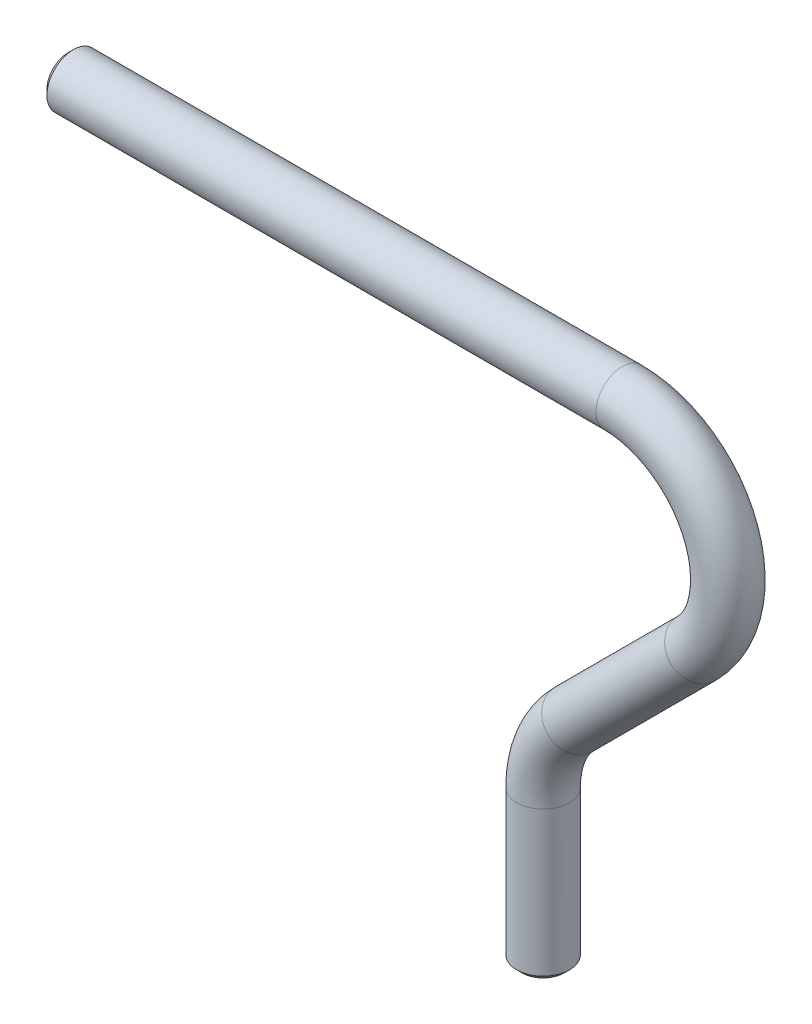
ISO-10303-21;
HEADER;
FILE_DESCRIPTION(('STEP AP214'),'2;1');
FILE_NAME('part.step','',(''),(''),'','','');
FILE_SCHEMA(('AUTOMOTIVE_DESIGN { 1 0 10303 214 1 1 1 1 }'));
ENDSEC;
DATA;
#1=APPLICATION_CONTEXT('core data for automotive mechanical design processes');
#2=APPLICATION_PROTOCOL_DEFINITION('international standard','automotive_design',2000,#1);
#3=PRODUCT_CONTEXT('',#1,'mechanical');
#4=PRODUCT('Part','Part','',(#3));
#5=PRODUCT_RELATED_PRODUCT_CATEGORY('part','',(#4));
#6=PRODUCT_DEFINITION_FORMATION('','',#4);
#7=PRODUCT_DEFINITION_CONTEXT('part definition',#1,'design');
#8=PRODUCT_DEFINITION('design','',#6,#7);
#9=PRODUCT_DEFINITION_SHAPE('','',#8);
#10=(LENGTH_UNIT() NAMED_UNIT(*) SI_UNIT(.MILLI.,.METRE.));
#11=(NAMED_UNIT(*) PLANE_ANGLE_UNIT() SI_UNIT($,.RADIAN.));
#12=(NAMED_UNIT(*) SI_UNIT($,.STERADIAN.) SOLID_ANGLE_UNIT());
#13=UNCERTAINTY_MEASURE_WITH_UNIT(LENGTH_MEASURE(1.E-05),#10,'distance_accuracy_value','');
#14=(GEOMETRIC_REPRESENTATION_CONTEXT(3) GLOBAL_UNCERTAINTY_ASSIGNED_CONTEXT((#13)) GLOBAL_UNIT_ASSIGNED_CONTEXT((#10,
#11,#12)) REPRESENTATION_CONTEXT('',''));
#15=CARTESIAN_POINT('',(0.,0.,0.));
#16=DIRECTION('',(0.,0.,1.));
#17=DIRECTION('',(1.,0.,0.));
#18=AXIS2_PLACEMENT_3D('',#15,#16,#17);
#19=CARTESIAN_POINT('',(0.,0.,0.));
#20=DIRECTION('',(1.,0.,0.));
#21=DIRECTION('',(0.,1.,0.));
#22=AXIS2_PLACEMENT_3D('',#19,#20,#21);
#23=CYLINDRICAL_SURFACE('',#22,5.);
#24=CARTESIAN_POINT('',(0.999999999999979,0.,0.));
#25=DIRECTION('',(1.,0.,0.));
#26=DIRECTION('',(0.,1.,0.));
#27=AXIS2_PLACEMENT_3D('',#24,#25,#26);
#28=CIRCLE('',#27,5.);
#29=CARTESIAN_POINT('',(0.999999999999979,5.,0.));
#30=VERTEX_POINT('',#29);
#31=EDGE_CURVE('E45',#30,#30,#28,.T.);
#32=ORIENTED_EDGE('',*,*,#31,.T.);
#33=EDGE_LOOP('',(#32));
#34=FACE_BOUND('',#33,.T.);
#35=CARTESIAN_POINT('',(105.,0.,0.));
#36=DIRECTION('',(1.,0.,0.));
#37=DIRECTION('',(0.,0.,-1.));
#38=AXIS2_PLACEMENT_3D('',#35,#36,#37);
#39=CIRCLE('',#38,5.);
#40=CARTESIAN_POINT('',(105.,5.,0.));
#41=VERTEX_POINT('',#40);
#42=EDGE_CURVE('E68',#41,#41,#39,.T.);
#43=ORIENTED_EDGE('',*,*,#42,.F.);
#44=EDGE_LOOP('',(#43));
#45=FACE_BOUND('',#44,.T.);
#46=ADVANCED_FACE('F37',(#34,#45),#23,.T.);
#47=CARTESIAN_POINT('',(105.,-20.,0.));
#48=DIRECTION('',(0.,0.,-1.));
#49=DIRECTION('',(-1.,0.,0.));
#50=AXIS2_PLACEMENT_3D('',#47,#48,#49);
#51=TOROIDAL_SURFACE('',#50,20.,5.);
#52=CARTESIAN_POINT('',(119.142135623731,-34.142135623731,0.));
#53=DIRECTION('',(-0.707106781186551,-0.707106781186544,0.));
#54=DIRECTION('',(0.,0.,-1.));
#55=AXIS2_PLACEMENT_3D('',#52,#53,#54);
#56=CIRCLE('',#55,5.);
#57=CARTESIAN_POINT('',(122.677669529664,-37.6776695296638,0.));
#58=VERTEX_POINT('',#57);
#59=EDGE_CURVE('E71',#58,#58,#56,.T.);
#60=CARTESIAN_POINT('',(105.,-20.,0.));
#61=DIRECTION('',(0.,0.,-1.));
#62=DIRECTION('',(-1.,0.,0.));
#63=AXIS2_PLACEMENT_3D('',#60,#61,#62);
#64=CIRCLE('',#63,25.);
#65=EDGE_CURVE('',#41,#58,#64,.T.);
#66=ORIENTED_EDGE('',*,*,#42,.T.);
#67=ORIENTED_EDGE('',*,*,#59,.F.);
#68=ORIENTED_EDGE('',*,*,#65,.T.);
#69=ORIENTED_EDGE('',*,*,#65,.F.);
#70=EDGE_LOOP('',(#66,#68,#67,#69));
#71=FACE_BOUND('',#70,.T.);
#72=ADVANCED_FACE('F118',(#71),#51,.T.);
#73=CARTESIAN_POINT('',(119.142135623731,-34.142135623731,0.));
#74=DIRECTION('',(-0.707106781186551,-0.707106781186544,0.));
#75=DIRECTION('',(0.707106781186544,-0.707106781186551,0.));
#76=AXIS2_PLACEMENT_3D('',#73,#74,#75);
#77=CYLINDRICAL_SURFACE('',#76,5.);
#78=CARTESIAN_POINT('',(95.8578643762691,-57.4264068711925,0.));
#79=DIRECTION('',(-0.707106781186551,-0.707106781186544,0.));
#80=DIRECTION('',(0.,0.,-1.));
#81=AXIS2_PLACEMENT_3D('',#78,#79,#80);
#82=CIRCLE('',#81,5.);
#83=CARTESIAN_POINT('',(92.3223304703364,-53.8908729652598,0.));
#84=VERTEX_POINT('',#83);
#85=EDGE_CURVE('E74',#84,#84,#82,.T.);
#86=ORIENTED_EDGE('',*,*,#85,.F.);
#87=EDGE_LOOP('',(#86));
#88=FACE_BOUND('',#87,.T.);
#89=ORIENTED_EDGE('',*,*,#59,.T.);
#90=EDGE_LOOP('',(#89));
#91=FACE_BOUND('',#90,.T.);
#92=ADVANCED_FACE('F121',(#88,#91),#77,.T.);
#93=CARTESIAN_POINT('',(110.,-71.5685424949235,0.));
#94=DIRECTION('',(0.,0.,1.));
#95=DIRECTION('',(1.,0.,0.));
#96=AXIS2_PLACEMENT_3D('',#93,#94,#95);
#97=TOROIDAL_SURFACE('',#96,20.,5.);
#98=CARTESIAN_POINT('',(90.,-71.5685424949235,0.));
#99=DIRECTION('',(0.,-1.,0.));
#100=DIRECTION('',(0.,0.,-1.));
#101=AXIS2_PLACEMENT_3D('',#98,#99,#100);
#102=CIRCLE('',#101,5.);
#103=CARTESIAN_POINT('',(85.,-71.5685424949235,0.));
#104=VERTEX_POINT('',#103);
#105=EDGE_CURVE('E77',#104,#104,#102,.T.);
#106=CARTESIAN_POINT('',(110.,-71.5685424949235,0.));
#107=DIRECTION('',(0.,0.,1.));
#108=DIRECTION('',(1.,0.,0.));
#109=AXIS2_PLACEMENT_3D('',#106,#107,#108);
#110=CIRCLE('',#109,25.);
#111=EDGE_CURVE('',#84,#104,#110,.T.);
#112=ORIENTED_EDGE('',*,*,#85,.T.);
#113=ORIENTED_EDGE('',*,*,#105,.F.);
#114=ORIENTED_EDGE('',*,*,#111,.T.);
#115=ORIENTED_EDGE('',*,*,#111,.F.);
#116=EDGE_LOOP('',(#112,#114,#113,#115));
#117=FACE_BOUND('',#116,.T.);
#118=ADVANCED_FACE('F125',(#117),#97,.T.);
#119=CARTESIAN_POINT('',(90.,-71.5685424949235,0.));
#120=DIRECTION('',(0.,-1.,0.));
#121=DIRECTION('',(0.,0.,-1.));
#122=AXIS2_PLACEMENT_3D('',#119,#120,#121);
#123=CYLINDRICAL_SURFACE('',#122,5.);
#124=CARTESIAN_POINT('',(90.,-99.,0.));
#125=DIRECTION('',(0.,-1.,0.));
#126=DIRECTION('',(0.,0.,-1.));
#127=AXIS2_PLACEMENT_3D('',#124,#125,#126);
#128=CIRCLE('',#127,5.);
#129=CARTESIAN_POINT('',(90.,-99.,-5.));
#130=VERTEX_POINT('',#129);
#131=EDGE_CURVE('E61',#130,#130,#128,.F.);
#132=ORIENTED_EDGE('',*,*,#131,.T.);
#133=EDGE_LOOP('',(#132));
#134=FACE_BOUND('',#133,.T.);
#135=ORIENTED_EDGE('',*,*,#105,.T.);
#136=EDGE_LOOP('',(#135));
#137=FACE_BOUND('',#136,.T.);
#138=ADVANCED_FACE('F114',(#134,#137),#123,.T.);
#139=CARTESIAN_POINT('',(0.,0.,0.));
#140=DIRECTION('',(1.,0.,0.));
#141=DIRECTION('',(0.,0.,-1.));
#142=AXIS2_PLACEMENT_3D('',#139,#140,#141);
#143=PLANE('',#142);
#144=CARTESIAN_POINT('',(0.,0.,0.));
#145=DIRECTION('',(1.,0.,0.));
#146=DIRECTION('',(0.,0.,-1.));
#147=AXIS2_PLACEMENT_3D('',#144,#145,#146);
#148=CIRCLE('',#147,4.00000000000002);
#149=CARTESIAN_POINT('',(0.,0.,-4.00000000000002));
#150=VERTEX_POINT('',#149);
#151=EDGE_CURVE('E11',#150,#150,#148,.F.);
#152=ORIENTED_EDGE('',*,*,#151,.T.);
#153=EDGE_LOOP('',(#152));
#154=FACE_BOUND('',#153,.T.);
#155=CARTESIAN_POINT('',(0.,0.,0.));
#156=DIRECTION('',(1.,0.,0.));
#157=DIRECTION('',(0.,0.,-1.));
#158=AXIS2_PLACEMENT_3D('',#155,#156,#157);
#159=CIRCLE('',#158,3.);
#160=CARTESIAN_POINT('',(0.,0.,-3.));
#161=VERTEX_POINT('',#160);
#162=EDGE_CURVE('E50',#161,#161,#159,.F.);
#163=ORIENTED_EDGE('',*,*,#162,.F.);
#164=EDGE_LOOP('',(#163));
#165=FACE_BOUND('',#164,.T.);
#166=ADVANCED_FACE('F110',(#154,#165),#143,.F.);
#167=CARTESIAN_POINT('',(90.,-100.,0.));
#168=DIRECTION('',(0.,-1.,0.));
#169=DIRECTION('',(0.,0.,-1.));
#170=AXIS2_PLACEMENT_3D('',#167,#168,#169);
#171=PLANE('',#170);
#172=CARTESIAN_POINT('',(90.,-100.,0.));
#173=DIRECTION('',(0.,-1.,0.));
#174=DIRECTION('',(1.,0.,0.));
#175=AXIS2_PLACEMENT_3D('',#172,#173,#174);
#176=CIRCLE('',#175,3.99999999999998);
#177=CARTESIAN_POINT('',(94.,-100.,0.));
#178=VERTEX_POINT('',#177);
#179=EDGE_CURVE('E57',#178,#178,#176,.T.);
#180=ORIENTED_EDGE('',*,*,#179,.T.);
#181=EDGE_LOOP('',(#180));
#182=FACE_BOUND('',#181,.T.);
#183=CARTESIAN_POINT('',(90.,-100.,0.));
#184=DIRECTION('',(0.,-1.,0.));
#185=DIRECTION('',(0.,0.,-1.));
#186=AXIS2_PLACEMENT_3D('',#183,#184,#185);
#187=CIRCLE('',#186,3.);
#188=CARTESIAN_POINT('',(90.,-100.,-3.));
#189=VERTEX_POINT('',#188);
#190=EDGE_CURVE('E54',#189,#189,#187,.F.);
#191=ORIENTED_EDGE('',*,*,#190,.T.);
#192=EDGE_LOOP('',(#191));
#193=FACE_BOUND('',#192,.T.);
#194=ADVANCED_FACE('F55',(#182,#193),#171,.T.);
#195=CARTESIAN_POINT('',(0.,0.,0.));
#196=DIRECTION('',(1.,0.,0.));
#197=DIRECTION('',(0.,1.,0.));
#198=AXIS2_PLACEMENT_3D('',#195,#196,#197);
#199=CYLINDRICAL_SURFACE('',#198,3.);
#200=CARTESIAN_POINT('',(105.,0.,0.));
#201=DIRECTION('',(1.,0.,0.));
#202=DIRECTION('',(0.,0.,-1.));
#203=AXIS2_PLACEMENT_3D('',#200,#201,#202);
#204=CIRCLE('',#203,3.);
#205=CARTESIAN_POINT('',(105.,3.,0.));
#206=VERTEX_POINT('',#205);
#207=EDGE_CURVE('E246',#206,#206,#204,.F.);
#208=ORIENTED_EDGE('',*,*,#207,.F.);
#209=EDGE_LOOP('',(#208));
#210=FACE_BOUND('',#209,.T.);
#211=ORIENTED_EDGE('',*,*,#162,.T.);
#212=EDGE_LOOP('',(#211));
#213=FACE_BOUND('',#212,.T.);
#214=ADVANCED_FACE('F109',(#210,#213),#199,.F.);
#215=CARTESIAN_POINT('',(105.,-20.,0.));
#216=DIRECTION('',(0.,0.,-1.));
#217=DIRECTION('',(-1.,0.,0.));
#218=AXIS2_PLACEMENT_3D('',#215,#216,#217);
#219=TOROIDAL_SURFACE('',#218,20.,3.);
#220=CARTESIAN_POINT('',(119.142135623731,-34.142135623731,0.));
#221=DIRECTION('',(-0.707106781186551,-0.707106781186544,0.));
#222=DIRECTION('',(0.,0.,-1.));
#223=AXIS2_PLACEMENT_3D('',#220,#221,#222);
#224=CIRCLE('',#223,3.);
#225=CARTESIAN_POINT('',(121.26345596729,-36.2634559672907,0.));
#226=VERTEX_POINT('',#225);
#227=EDGE_CURVE('E245',#226,#226,#224,.F.);
#228=CARTESIAN_POINT('',(105.,-20.,0.));
#229=DIRECTION('',(0.,0.,-1.));
#230=DIRECTION('',(-1.,0.,0.));
#231=AXIS2_PLACEMENT_3D('',#228,#229,#230);
#232=CIRCLE('',#231,23.);
#233=EDGE_CURVE('',#206,#226,#232,.T.);
#234=ORIENTED_EDGE('',*,*,#207,.T.);
#235=ORIENTED_EDGE('',*,*,#227,.F.);
#236=ORIENTED_EDGE('',*,*,#233,.T.);
#237=ORIENTED_EDGE('',*,*,#233,.F.);
#238=EDGE_LOOP('',(#234,#236,#235,#237));
#239=FACE_BOUND('',#238,.T.);
#240=ADVANCED_FACE('F164',(#239),#219,.F.);
#241=CARTESIAN_POINT('',(119.142135623731,-34.142135623731,0.));
#242=DIRECTION('',(-0.707106781186551,-0.707106781186544,0.));
#243=DIRECTION('',(0.707106781186544,-0.707106781186551,0.));
#244=AXIS2_PLACEMENT_3D('',#241,#242,#243);
#245=CYLINDRICAL_SURFACE('',#244,3.);
#246=CARTESIAN_POINT('',(95.8578643762691,-57.4264068711925,0.));
#247=DIRECTION('',(-0.707106781186551,-0.707106781186544,0.));
#248=DIRECTION('',(0.,0.,-1.));
#249=AXIS2_PLACEMENT_3D('',#246,#247,#248);
#250=CIRCLE('',#249,3.);
#251=CARTESIAN_POINT('',(93.7365440327095,-55.3050865276329,0.));
#252=VERTEX_POINT('',#251);
#253=EDGE_CURVE('E64',#252,#252,#250,.F.);
#254=ORIENTED_EDGE('',*,*,#253,.F.);
#255=EDGE_LOOP('',(#254));
#256=FACE_BOUND('',#255,.T.);
#257=ORIENTED_EDGE('',*,*,#227,.T.);
#258=EDGE_LOOP('',(#257));
#259=FACE_BOUND('',#258,.T.);
#260=ADVANCED_FACE('F101',(#256,#259),#245,.F.);
#261=CARTESIAN_POINT('',(110.,-71.5685424949235,0.));
#262=DIRECTION('',(0.,0.,1.));
#263=DIRECTION('',(1.,0.,0.));
#264=AXIS2_PLACEMENT_3D('',#261,#262,#263);
#265=TOROIDAL_SURFACE('',#264,20.,3.);
#266=CARTESIAN_POINT('',(90.,-71.5685424949235,0.));
#267=DIRECTION('',(0.,-1.,0.));
#268=DIRECTION('',(0.,0.,-1.));
#269=AXIS2_PLACEMENT_3D('',#266,#267,#268);
#270=CIRCLE('',#269,3.);
#271=CARTESIAN_POINT('',(87.,-71.5685424949235,0.));
#272=VERTEX_POINT('',#271);
#273=EDGE_CURVE('E58',#272,#272,#270,.F.);
#274=CARTESIAN_POINT('',(110.,-71.5685424949235,0.));
#275=DIRECTION('',(0.,0.,1.));
#276=DIRECTION('',(1.,0.,0.));
#277=AXIS2_PLACEMENT_3D('',#274,#275,#276);
#278=CIRCLE('',#277,23.);
#279=EDGE_CURVE('',#252,#272,#278,.T.);
#280=ORIENTED_EDGE('',*,*,#253,.T.);
#281=ORIENTED_EDGE('',*,*,#273,.F.);
#282=ORIENTED_EDGE('',*,*,#279,.T.);
#283=ORIENTED_EDGE('',*,*,#279,.F.);
#284=EDGE_LOOP('',(#280,#282,#281,#283));
#285=FACE_BOUND('',#284,.T.);
#286=ADVANCED_FACE('F96',(#285),#265,.F.);
#287=CARTESIAN_POINT('',(90.,-71.5685424949235,0.));
#288=DIRECTION('',(0.,-1.,0.));
#289=DIRECTION('',(0.,0.,-1.));
#290=AXIS2_PLACEMENT_3D('',#287,#288,#289);
#291=CYLINDRICAL_SURFACE('',#290,3.);
#292=ORIENTED_EDGE('',*,*,#190,.F.);
#293=EDGE_LOOP('',(#292));
#294=FACE_BOUND('',#293,.T.);
#295=ORIENTED_EDGE('',*,*,#273,.T.);
#296=EDGE_LOOP('',(#295));
#297=FACE_BOUND('',#296,.T.);
#298=ADVANCED_FACE('F92',(#294,#297),#291,.F.);
#299=CARTESIAN_POINT('',(90.,-100.,0.));
#300=DIRECTION('',(0.,1.,0.));
#301=DIRECTION('',(0.,0.,1.));
#302=AXIS2_PLACEMENT_3D('',#299,#300,#301);
#303=CONICAL_SURFACE('',#302,3.99999999999998,0.785398163397446);
#304=ORIENTED_EDGE('',*,*,#131,.F.);
#305=EDGE_LOOP('',(#304));
#306=FACE_BOUND('',#305,.T.);
#307=ORIENTED_EDGE('',*,*,#179,.F.);
#308=EDGE_LOOP('',(#307));
#309=FACE_BOUND('',#308,.T.);
#310=ADVANCED_FACE('F87',(#306,#309),#303,.T.);
#311=CARTESIAN_POINT('',(0.999999999999979,0.,0.));
#312=DIRECTION('',(1.,0.,0.));
#313=DIRECTION('',(0.,1.,0.));
#314=AXIS2_PLACEMENT_3D('',#311,#312,#313);
#315=CONICAL_SURFACE('',#314,5.,0.78539816339745);
#316=ORIENTED_EDGE('',*,*,#151,.F.);
#317=EDGE_LOOP('',(#316));
#318=FACE_BOUND('',#317,.T.);
#319=ORIENTED_EDGE('',*,*,#31,.F.);
#320=EDGE_LOOP('',(#319));
#321=FACE_BOUND('',#320,.T.);
#322=ADVANCED_FACE('F39',(#318,#321),#315,.T.);
#323=CLOSED_SHELL('',(#46,#72,#92,#118,#138,#166,#194,#214,#240,#260,#286,#298,#310,#322));
#324=MANIFOLD_SOLID_BREP('B2',#323);
#325=ADVANCED_BREP_SHAPE_REPRESENTATION('',(#18,#324),#14);
#326=SHAPE_DEFINITION_REPRESENTATION(#9,#325);
ENDSEC;
END-ISO-10303-21;
